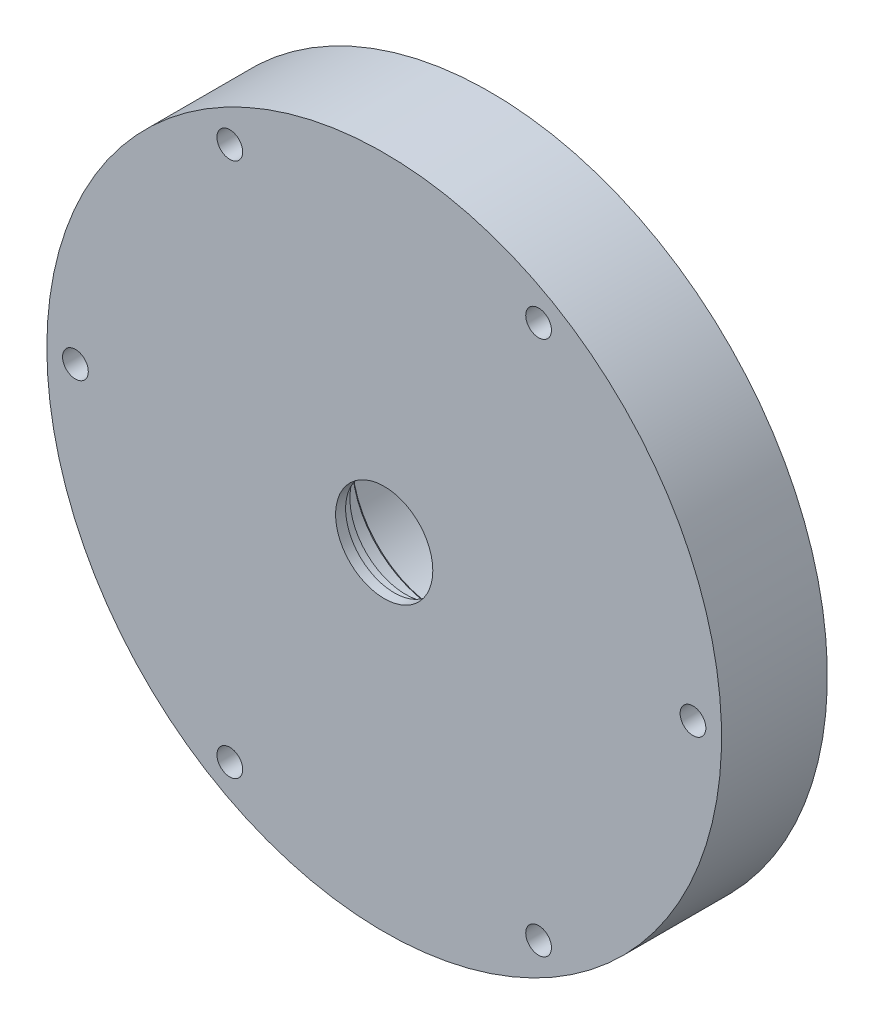
ISO-10303-21;
HEADER;
FILE_DESCRIPTION(('STEP AP214'),'2;1');
FILE_NAME('part.step','',(''),(''),'','','');
FILE_SCHEMA(('AUTOMOTIVE_DESIGN { 1 0 10303 214 1 1 1 1 }'));
ENDSEC;
DATA;
#1=APPLICATION_CONTEXT('core data for automotive mechanical design processes');
#2=APPLICATION_PROTOCOL_DEFINITION('international standard','automotive_design',2000,#1);
#3=PRODUCT_CONTEXT('',#1,'mechanical');
#4=PRODUCT('Part','Part','',(#3));
#5=PRODUCT_RELATED_PRODUCT_CATEGORY('part','',(#4));
#6=PRODUCT_DEFINITION_FORMATION('','',#4);
#7=PRODUCT_DEFINITION_CONTEXT('part definition',#1,'design');
#8=PRODUCT_DEFINITION('design','',#6,#7);
#9=PRODUCT_DEFINITION_SHAPE('','',#8);
#10=(LENGTH_UNIT() NAMED_UNIT(*) SI_UNIT(.MILLI.,.METRE.));
#11=(NAMED_UNIT(*) PLANE_ANGLE_UNIT() SI_UNIT($,.RADIAN.));
#12=(NAMED_UNIT(*) SI_UNIT($,.STERADIAN.) SOLID_ANGLE_UNIT());
#13=UNCERTAINTY_MEASURE_WITH_UNIT(LENGTH_MEASURE(1.E-05),#10,'distance_accuracy_value','');
#14=(GEOMETRIC_REPRESENTATION_CONTEXT(3) GLOBAL_UNCERTAINTY_ASSIGNED_CONTEXT((#13)) GLOBAL_UNIT_ASSIGNED_CONTEXT((#10,
#11,#12)) REPRESENTATION_CONTEXT('',''));
#15=CARTESIAN_POINT('',(0.,0.,0.));
#16=DIRECTION('',(0.,0.,1.));
#17=DIRECTION('',(1.,0.,0.));
#18=AXIS2_PLACEMENT_3D('',#15,#16,#17);
#19=CARTESIAN_POINT('',(0.,0.,0.));
#20=DIRECTION('',(0.,0.,1.));
#21=DIRECTION('',(1.,0.,0.));
#22=AXIS2_PLACEMENT_3D('',#19,#20,#21);
#23=PLANE('',#22);
#24=CARTESIAN_POINT('',(-108.,0.,0.));
#25=DIRECTION('',(0.,0.,1.));
#26=DIRECTION('',(1.,0.,0.));
#27=AXIS2_PLACEMENT_3D('',#24,#25,#26);
#28=CIRCLE('',#27,4.50000000000001);
#29=CARTESIAN_POINT('',(-103.5,0.,0.));
#30=VERTEX_POINT('',#29);
#31=EDGE_CURVE('E144',#30,#30,#28,.T.);
#32=ORIENTED_EDGE('',*,*,#31,.F.);
#33=EDGE_LOOP('',(#32));
#34=FACE_BOUND('',#33,.T.);
#35=CARTESIAN_POINT('',(-53.9999999999998,-93.5307436087195,0.));
#36=DIRECTION('',(0.,0.,1.));
#37=DIRECTION('',(1.,0.,0.));
#38=AXIS2_PLACEMENT_3D('',#35,#36,#37);
#39=CIRCLE('',#38,4.50000000000001);
#40=CARTESIAN_POINT('',(-49.4999999999998,-93.5307436087195,0.));
#41=VERTEX_POINT('',#40);
#42=EDGE_CURVE('E138',#41,#41,#39,.T.);
#43=ORIENTED_EDGE('',*,*,#42,.F.);
#44=EDGE_LOOP('',(#43));
#45=FACE_BOUND('',#44,.T.);
#46=CARTESIAN_POINT('',(54.0000000000004,-93.5307436087191,0.));
#47=DIRECTION('',(0.,0.,1.));
#48=DIRECTION('',(1.,0.,0.));
#49=AXIS2_PLACEMENT_3D('',#46,#47,#48);
#50=CIRCLE('',#49,4.50000000000001);
#51=CARTESIAN_POINT('',(58.5000000000004,-93.5307436087191,0.));
#52=VERTEX_POINT('',#51);
#53=EDGE_CURVE('E132',#52,#52,#50,.T.);
#54=ORIENTED_EDGE('',*,*,#53,.F.);
#55=EDGE_LOOP('',(#54));
#56=FACE_BOUND('',#55,.T.);
#57=CARTESIAN_POINT('',(108.,7.54159969190117E-13,0.));
#58=DIRECTION('',(0.,0.,1.));
#59=DIRECTION('',(1.,0.,0.));
#60=AXIS2_PLACEMENT_3D('',#57,#58,#59);
#61=CIRCLE('',#60,4.50000000000001);
#62=CARTESIAN_POINT('',(112.5,7.54159969190117E-13,0.));
#63=VERTEX_POINT('',#62);
#64=EDGE_CURVE('E126',#63,#63,#61,.T.);
#65=ORIENTED_EDGE('',*,*,#64,.F.);
#66=EDGE_LOOP('',(#65));
#67=FACE_BOUND('',#66,.T.);
#68=CARTESIAN_POINT('',(53.9999999999991,93.5307436087198,0.));
#69=DIRECTION('',(0.,0.,1.));
#70=DIRECTION('',(1.,0.,0.));
#71=AXIS2_PLACEMENT_3D('',#68,#69,#70);
#72=CIRCLE('',#71,4.50000000000001);
#73=CARTESIAN_POINT('',(58.4999999999991,93.5307436087198,0.));
#74=VERTEX_POINT('',#73);
#75=EDGE_CURVE('E120',#74,#74,#72,.T.);
#76=ORIENTED_EDGE('',*,*,#75,.F.);
#77=EDGE_LOOP('',(#76));
#78=FACE_BOUND('',#77,.T.);
#79=CARTESIAN_POINT('',(-54.0000000000011,93.5307436087187,0.));
#80=DIRECTION('',(0.,0.,1.));
#81=DIRECTION('',(1.,0.,0.));
#82=AXIS2_PLACEMENT_3D('',#79,#80,#81);
#83=CIRCLE('',#82,4.50000000000001);
#84=CARTESIAN_POINT('',(-49.5000000000011,93.5307436087187,0.));
#85=VERTEX_POINT('',#84);
#86=EDGE_CURVE('E114',#85,#85,#83,.T.);
#87=ORIENTED_EDGE('',*,*,#86,.F.);
#88=EDGE_LOOP('',(#87));
#89=FACE_BOUND('',#88,.T.);
#90=CARTESIAN_POINT('',(0.,0.,0.));
#91=DIRECTION('',(0.,0.,1.));
#92=DIRECTION('',(1.,0.,0.));
#93=AXIS2_PLACEMENT_3D('',#90,#91,#92);
#94=CIRCLE('',#93,17.);
#95=CARTESIAN_POINT('',(17.,0.,0.));
#96=VERTEX_POINT('',#95);
#97=EDGE_CURVE('E96',#96,#96,#94,.T.);
#98=ORIENTED_EDGE('',*,*,#97,.F.);
#99=EDGE_LOOP('',(#98));
#100=FACE_BOUND('',#99,.T.);
#101=CARTESIAN_POINT('',(0.,0.,0.));
#102=DIRECTION('',(0.,0.,-1.));
#103=DIRECTION('',(-1.,0.,0.));
#104=AXIS2_PLACEMENT_3D('',#101,#102,#103);
#105=CIRCLE('',#104,118.);
#106=CARTESIAN_POINT('',(-118.,0.,0.));
#107=VERTEX_POINT('',#106);
#108=EDGE_CURVE('E60',#107,#107,#105,.T.);
#109=ORIENTED_EDGE('',*,*,#108,.F.);
#110=EDGE_LOOP('',(#109));
#111=FACE_BOUND('',#110,.T.);
#112=ADVANCED_FACE('F39',(#34,#45,#56,#67,#78,#89,#100,#111),#23,.T.);
#113=CARTESIAN_POINT('',(0.,0.,-48.));
#114=DIRECTION('',(0.,0.,-1.));
#115=DIRECTION('',(-1.,0.,0.));
#116=AXIS2_PLACEMENT_3D('',#113,#114,#115);
#117=CYLINDRICAL_SURFACE('',#116,118.);
#118=ORIENTED_EDGE('',*,*,#108,.T.);
#119=EDGE_LOOP('',(#118));
#120=FACE_BOUND('',#119,.T.);
#121=CARTESIAN_POINT('',(0.,0.,-37.));
#122=DIRECTION('',(0.,0.,-1.));
#123=DIRECTION('',(-1.,0.,0.));
#124=AXIS2_PLACEMENT_3D('',#121,#122,#123);
#125=CIRCLE('',#124,118.);
#126=CARTESIAN_POINT('',(-118.,0.,-37.));
#127=VERTEX_POINT('',#126);
#128=EDGE_CURVE('E63',#127,#127,#125,.T.);
#129=ORIENTED_EDGE('',*,*,#128,.F.);
#130=EDGE_LOOP('',(#129));
#131=FACE_BOUND('',#130,.T.);
#132=ADVANCED_FACE('F158',(#120,#131),#117,.T.);
#133=CARTESIAN_POINT('',(0.,118.,-37.));
#134=DIRECTION('',(0.,0.,-1.));
#135=DIRECTION('',(-1.,0.,0.));
#136=AXIS2_PLACEMENT_3D('',#133,#134,#135);
#137=PLANE('',#136);
#138=CARTESIAN_POINT('',(-108.,0.,-37.));
#139=DIRECTION('',(0.,0.,-1.));
#140=DIRECTION('',(-1.,0.,0.));
#141=AXIS2_PLACEMENT_3D('',#138,#139,#140);
#142=CIRCLE('',#141,4.50000000000002);
#143=CARTESIAN_POINT('',(-112.5,0.,-37.));
#144=VERTEX_POINT('',#143);
#145=EDGE_CURVE('E147',#144,#144,#142,.T.);
#146=ORIENTED_EDGE('',*,*,#145,.F.);
#147=EDGE_LOOP('',(#146));
#148=FACE_BOUND('',#147,.T.);
#149=CARTESIAN_POINT('',(-53.9999999999998,-93.5307436087195,-37.));
#150=DIRECTION('',(0.,0.,-1.));
#151=DIRECTION('',(-1.,0.,0.));
#152=AXIS2_PLACEMENT_3D('',#149,#150,#151);
#153=CIRCLE('',#152,4.50000000000001);
#154=CARTESIAN_POINT('',(-58.4999999999998,-93.5307436087195,-37.));
#155=VERTEX_POINT('',#154);
#156=EDGE_CURVE('E141',#155,#155,#153,.T.);
#157=ORIENTED_EDGE('',*,*,#156,.F.);
#158=EDGE_LOOP('',(#157));
#159=FACE_BOUND('',#158,.T.);
#160=CARTESIAN_POINT('',(54.0000000000004,-93.5307436087191,-37.));
#161=DIRECTION('',(0.,0.,-1.));
#162=DIRECTION('',(-1.,0.,0.));
#163=AXIS2_PLACEMENT_3D('',#160,#161,#162);
#164=CIRCLE('',#163,4.50000000000001);
#165=CARTESIAN_POINT('',(49.5000000000004,-93.5307436087191,-37.));
#166=VERTEX_POINT('',#165);
#167=EDGE_CURVE('E135',#166,#166,#164,.T.);
#168=ORIENTED_EDGE('',*,*,#167,.F.);
#169=EDGE_LOOP('',(#168));
#170=FACE_BOUND('',#169,.T.);
#171=CARTESIAN_POINT('',(108.,7.54159969190117E-13,-37.));
#172=DIRECTION('',(0.,0.,-1.));
#173=DIRECTION('',(-1.,0.,0.));
#174=AXIS2_PLACEMENT_3D('',#171,#172,#173);
#175=CIRCLE('',#174,4.50000000000002);
#176=CARTESIAN_POINT('',(103.5,7.54159969190117E-13,-37.));
#177=VERTEX_POINT('',#176);
#178=EDGE_CURVE('E129',#177,#177,#175,.T.);
#179=ORIENTED_EDGE('',*,*,#178,.F.);
#180=EDGE_LOOP('',(#179));
#181=FACE_BOUND('',#180,.T.);
#182=CARTESIAN_POINT('',(53.9999999999991,93.5307436087198,-37.));
#183=DIRECTION('',(0.,0.,-1.));
#184=DIRECTION('',(-1.,0.,0.));
#185=AXIS2_PLACEMENT_3D('',#182,#183,#184);
#186=CIRCLE('',#185,4.50000000000001);
#187=CARTESIAN_POINT('',(49.4999999999991,93.5307436087198,-37.));
#188=VERTEX_POINT('',#187);
#189=EDGE_CURVE('E123',#188,#188,#186,.T.);
#190=ORIENTED_EDGE('',*,*,#189,.F.);
#191=EDGE_LOOP('',(#190));
#192=FACE_BOUND('',#191,.T.);
#193=CARTESIAN_POINT('',(-54.0000000000011,93.5307436087187,-37.));
#194=DIRECTION('',(0.,0.,-1.));
#195=DIRECTION('',(-1.,0.,0.));
#196=AXIS2_PLACEMENT_3D('',#193,#194,#195);
#197=CIRCLE('',#196,4.50000000000001);
#198=CARTESIAN_POINT('',(-58.5000000000011,93.5307436087187,-37.));
#199=VERTEX_POINT('',#198);
#200=EDGE_CURVE('E117',#199,#199,#197,.T.);
#201=ORIENTED_EDGE('',*,*,#200,.F.);
#202=EDGE_LOOP('',(#201));
#203=FACE_BOUND('',#202,.T.);
#204=ORIENTED_EDGE('',*,*,#128,.T.);
#205=EDGE_LOOP('',(#204));
#206=FACE_BOUND('',#205,.T.);
#207=CARTESIAN_POINT('',(0.,0.,-37.));
#208=DIRECTION('',(0.,0.,-1.));
#209=DIRECTION('',(-1.,0.,0.));
#210=AXIS2_PLACEMENT_3D('',#207,#208,#209);
#211=CIRCLE('',#210,95.);
#212=CARTESIAN_POINT('',(-95.,0.,-37.));
#213=VERTEX_POINT('',#212);
#214=EDGE_CURVE('E66',#213,#213,#211,.T.);
#215=ORIENTED_EDGE('',*,*,#214,.F.);
#216=EDGE_LOOP('',(#215));
#217=FACE_BOUND('',#216,.T.);
#218=ADVANCED_FACE('F154',(#148,#159,#170,#181,#192,#203,#206,#217),#137,.T.);
#219=CARTESIAN_POINT('',(0.,0.,-48.));
#220=DIRECTION('',(0.,0.,-1.));
#221=DIRECTION('',(-1.,0.,0.));
#222=AXIS2_PLACEMENT_3D('',#219,#220,#221);
#223=CYLINDRICAL_SURFACE('',#222,95.);
#224=ORIENTED_EDGE('',*,*,#214,.T.);
#225=EDGE_LOOP('',(#224));
#226=FACE_BOUND('',#225,.T.);
#227=CARTESIAN_POINT('',(0.,0.,-45.));
#228=DIRECTION('',(0.,0.,-1.));
#229=DIRECTION('',(-1.,0.,0.));
#230=AXIS2_PLACEMENT_3D('',#227,#228,#229);
#231=CIRCLE('',#230,95.);
#232=CARTESIAN_POINT('',(-95.,0.,-45.));
#233=VERTEX_POINT('',#232);
#234=EDGE_CURVE('E69',#233,#233,#231,.T.);
#235=ORIENTED_EDGE('',*,*,#234,.F.);
#236=EDGE_LOOP('',(#235));
#237=FACE_BOUND('',#236,.T.);
#238=ADVANCED_FACE('F157',(#226,#237),#223,.T.);
#239=CARTESIAN_POINT('',(0.,95.,-45.));
#240=DIRECTION('',(0.,0.,1.));
#241=DIRECTION('',(1.,0.,0.));
#242=AXIS2_PLACEMENT_3D('',#239,#240,#241);
#243=PLANE('',#242);
#244=ORIENTED_EDGE('',*,*,#234,.T.);
#245=EDGE_LOOP('',(#244));
#246=FACE_BOUND('',#245,.T.);
#247=CARTESIAN_POINT('',(0.,0.,-45.));
#248=DIRECTION('',(0.,0.,-1.));
#249=DIRECTION('',(-1.,0.,0.));
#250=AXIS2_PLACEMENT_3D('',#247,#248,#249);
#251=CIRCLE('',#250,99.);
#252=CARTESIAN_POINT('',(-99.,0.,-45.));
#253=VERTEX_POINT('',#252);
#254=EDGE_CURVE('E72',#253,#253,#251,.T.);
#255=ORIENTED_EDGE('',*,*,#254,.F.);
#256=EDGE_LOOP('',(#255));
#257=FACE_BOUND('',#256,.T.);
#258=ADVANCED_FACE('F176',(#246,#257),#243,.T.);
#259=CARTESIAN_POINT('',(0.,0.,-48.));
#260=DIRECTION('',(0.,0.,-1.));
#261=DIRECTION('',(-1.,0.,0.));
#262=AXIS2_PLACEMENT_3D('',#259,#260,#261);
#263=CYLINDRICAL_SURFACE('',#262,99.);
#264=ORIENTED_EDGE('',*,*,#254,.T.);
#265=EDGE_LOOP('',(#264));
#266=FACE_BOUND('',#265,.T.);
#267=CARTESIAN_POINT('',(0.,0.,-48.));
#268=DIRECTION('',(0.,0.,-1.));
#269=DIRECTION('',(-1.,0.,0.));
#270=AXIS2_PLACEMENT_3D('',#267,#268,#269);
#271=CIRCLE('',#270,99.);
#272=CARTESIAN_POINT('',(-99.,0.,-48.));
#273=VERTEX_POINT('',#272);
#274=EDGE_CURVE('E75',#273,#273,#271,.T.);
#275=ORIENTED_EDGE('',*,*,#274,.F.);
#276=EDGE_LOOP('',(#275));
#277=FACE_BOUND('',#276,.T.);
#278=ADVANCED_FACE('F182',(#266,#277),#263,.T.);
#279=CARTESIAN_POINT('',(0.,99.,-48.));
#280=DIRECTION('',(0.,0.,-1.));
#281=DIRECTION('',(-1.,0.,0.));
#282=AXIS2_PLACEMENT_3D('',#279,#280,#281);
#283=PLANE('',#282);
#284=CARTESIAN_POINT('',(0.,0.,-48.));
#285=DIRECTION('',(0.,0.,1.));
#286=DIRECTION('',(1.,0.,0.));
#287=AXIS2_PLACEMENT_3D('',#284,#285,#286);
#288=CIRCLE('',#287,91.);
#289=CARTESIAN_POINT('',(91.,0.,-48.));
#290=VERTEX_POINT('',#289);
#291=EDGE_CURVE('E78',#290,#290,#288,.T.);
#292=ORIENTED_EDGE('',*,*,#291,.T.);
#293=EDGE_LOOP('',(#292));
#294=FACE_BOUND('',#293,.T.);
#295=ORIENTED_EDGE('',*,*,#274,.T.);
#296=EDGE_LOOP('',(#295));
#297=FACE_BOUND('',#296,.T.);
#298=ADVANCED_FACE('F188',(#294,#297),#283,.T.);
#299=CARTESIAN_POINT('',(0.,0.,0.));
#300=DIRECTION('',(0.,0.,1.));
#301=DIRECTION('',(1.,0.,0.));
#302=AXIS2_PLACEMENT_3D('',#299,#300,#301);
#303=CYLINDRICAL_SURFACE('',#302,91.);
#304=CARTESIAN_POINT('',(0.,0.,-11.));
#305=DIRECTION('',(0.,0.,1.));
#306=DIRECTION('',(1.,0.,0.));
#307=AXIS2_PLACEMENT_3D('',#304,#305,#306);
#308=CIRCLE('',#307,91.);
#309=CARTESIAN_POINT('',(91.,0.,-11.));
#310=VERTEX_POINT('',#309);
#311=EDGE_CURVE('E81',#310,#310,#308,.T.);
#312=ORIENTED_EDGE('',*,*,#311,.T.);
#313=EDGE_LOOP('',(#312));
#314=FACE_BOUND('',#313,.T.);
#315=ORIENTED_EDGE('',*,*,#291,.F.);
#316=EDGE_LOOP('',(#315));
#317=FACE_BOUND('',#316,.T.);
#318=ADVANCED_FACE('F193',(#314,#317),#303,.F.);
#319=CARTESIAN_POINT('',(0.,91.,-11.));
#320=DIRECTION('',(0.,0.,-1.));
#321=DIRECTION('',(-1.,0.,0.));
#322=AXIS2_PLACEMENT_3D('',#319,#320,#321);
#323=PLANE('',#322);
#324=CARTESIAN_POINT('',(0.,0.,-11.));
#325=DIRECTION('',(0.,0.,1.));
#326=DIRECTION('',(1.,0.,0.));
#327=AXIS2_PLACEMENT_3D('',#324,#325,#326);
#328=CIRCLE('',#327,56.);
#329=CARTESIAN_POINT('',(56.,0.,-11.));
#330=VERTEX_POINT('',#329);
#331=EDGE_CURVE('E84',#330,#330,#328,.T.);
#332=ORIENTED_EDGE('',*,*,#331,.T.);
#333=EDGE_LOOP('',(#332));
#334=FACE_BOUND('',#333,.T.);
#335=ORIENTED_EDGE('',*,*,#311,.F.);
#336=EDGE_LOOP('',(#335));
#337=FACE_BOUND('',#336,.T.);
#338=ADVANCED_FACE('F199',(#334,#337),#323,.T.);
#339=CARTESIAN_POINT('',(0.,0.,0.));
#340=DIRECTION('',(0.,0.,1.));
#341=DIRECTION('',(1.,0.,0.));
#342=AXIS2_PLACEMENT_3D('',#339,#340,#341);
#343=CYLINDRICAL_SURFACE('',#342,56.);
#344=CARTESIAN_POINT('',(0.,0.,-12.5));
#345=DIRECTION('',(0.,0.,1.));
#346=DIRECTION('',(1.,0.,0.));
#347=AXIS2_PLACEMENT_3D('',#344,#345,#346);
#348=CIRCLE('',#347,56.);
#349=CARTESIAN_POINT('',(56.,0.,-12.5));
#350=VERTEX_POINT('',#349);
#351=EDGE_CURVE('E87',#350,#350,#348,.T.);
#352=ORIENTED_EDGE('',*,*,#351,.T.);
#353=EDGE_LOOP('',(#352));
#354=FACE_BOUND('',#353,.T.);
#355=ORIENTED_EDGE('',*,*,#331,.F.);
#356=EDGE_LOOP('',(#355));
#357=FACE_BOUND('',#356,.T.);
#358=ADVANCED_FACE('F277',(#354,#357),#343,.T.);
#359=CARTESIAN_POINT('',(0.,56.,-12.5));
#360=DIRECTION('',(0.,0.,-1.));
#361=DIRECTION('',(-1.,0.,0.));
#362=AXIS2_PLACEMENT_3D('',#359,#360,#361);
#363=PLANE('',#362);
#364=CARTESIAN_POINT('',(0.,0.,-12.5));
#365=DIRECTION('',(0.,0.,1.));
#366=DIRECTION('',(1.,0.,0.));
#367=AXIS2_PLACEMENT_3D('',#364,#365,#366);
#368=CIRCLE('',#367,45.);
#369=CARTESIAN_POINT('',(45.,0.,-12.5));
#370=VERTEX_POINT('',#369);
#371=EDGE_CURVE('E90',#370,#370,#368,.T.);
#372=ORIENTED_EDGE('',*,*,#371,.T.);
#373=EDGE_LOOP('',(#372));
#374=FACE_BOUND('',#373,.T.);
#375=ORIENTED_EDGE('',*,*,#351,.F.);
#376=EDGE_LOOP('',(#375));
#377=FACE_BOUND('',#376,.T.);
#378=ADVANCED_FACE('F273',(#374,#377),#363,.T.);
#379=CARTESIAN_POINT('',(0.,0.,0.));
#380=DIRECTION('',(0.,0.,1.));
#381=DIRECTION('',(1.,0.,0.));
#382=AXIS2_PLACEMENT_3D('',#379,#380,#381);
#383=CYLINDRICAL_SURFACE('',#382,45.);
#384=CARTESIAN_POINT('',(0.,0.,-38.75));
#385=DIRECTION('',(0.,0.,1.));
#386=DIRECTION('',(1.,0.,0.));
#387=AXIS2_PLACEMENT_3D('',#384,#385,#386);
#388=CIRCLE('',#387,45.);
#389=CARTESIAN_POINT('',(45.,0.,-38.75));
#390=VERTEX_POINT('',#389);
#391=EDGE_CURVE('E93',#390,#390,#388,.T.);
#392=ORIENTED_EDGE('',*,*,#391,.T.);
#393=EDGE_LOOP('',(#392));
#394=FACE_BOUND('',#393,.T.);
#395=ORIENTED_EDGE('',*,*,#371,.F.);
#396=EDGE_LOOP('',(#395));
#397=FACE_BOUND('',#396,.T.);
#398=ADVANCED_FACE('F270',(#394,#397),#383,.T.);
#399=CARTESIAN_POINT('',(0.,45.,-38.75));
#400=DIRECTION('',(0.,0.,-1.));
#401=DIRECTION('',(-1.,0.,0.));
#402=AXIS2_PLACEMENT_3D('',#399,#400,#401);
#403=PLANE('',#402);
#404=CARTESIAN_POINT('',(0.,0.,-38.75));
#405=DIRECTION('',(0.,0.,-1.));
#406=DIRECTION('',(-1.,0.,0.));
#407=AXIS2_PLACEMENT_3D('',#404,#405,#406);
#408=CIRCLE('',#407,37.);
#409=CARTESIAN_POINT('',(-37.,0.,-38.75));
#410=VERTEX_POINT('',#409);
#411=EDGE_CURVE('E47',#410,#410,#408,.F.);
#412=ORIENTED_EDGE('',*,*,#411,.T.);
#413=EDGE_LOOP('',(#412));
#414=FACE_BOUND('',#413,.T.);
#415=ORIENTED_EDGE('',*,*,#391,.F.);
#416=EDGE_LOOP('',(#415));
#417=FACE_BOUND('',#416,.T.);
#418=ADVANCED_FACE('F266',(#414,#417),#403,.T.);
#419=CARTESIAN_POINT('',(0.,0.,0.));
#420=DIRECTION('',(0.,0.,1.));
#421=DIRECTION('',(1.,0.,0.));
#422=AXIS2_PLACEMENT_3D('',#419,#420,#421);
#423=CYLINDRICAL_SURFACE('',#422,17.);
#424=ORIENTED_EDGE('',*,*,#97,.T.);
#425=EDGE_LOOP('',(#424));
#426=FACE_BOUND('',#425,.T.);
#427=CARTESIAN_POINT('',(0.,0.,-3.5));
#428=DIRECTION('',(0.,0.,1.));
#429=DIRECTION('',(1.,0.,0.));
#430=AXIS2_PLACEMENT_3D('',#427,#428,#429);
#431=CIRCLE('',#430,17.);
#432=CARTESIAN_POINT('',(17.,0.,-3.5));
#433=VERTEX_POINT('',#432);
#434=EDGE_CURVE('E99',#433,#433,#431,.T.);
#435=ORIENTED_EDGE('',*,*,#434,.F.);
#436=EDGE_LOOP('',(#435));
#437=FACE_BOUND('',#436,.T.);
#438=ADVANCED_FACE('F262',(#426,#437),#423,.F.);
#439=CARTESIAN_POINT('',(0.,17.,-3.5));
#440=DIRECTION('',(0.,0.,-1.));
#441=DIRECTION('',(-1.,0.,0.));
#442=AXIS2_PLACEMENT_3D('',#439,#440,#441);
#443=PLANE('',#442);
#444=ORIENTED_EDGE('',*,*,#434,.T.);
#445=EDGE_LOOP('',(#444));
#446=FACE_BOUND('',#445,.T.);
#447=CARTESIAN_POINT('',(0.,0.,-3.5));
#448=DIRECTION('',(0.,0.,1.));
#449=DIRECTION('',(1.,0.,0.));
#450=AXIS2_PLACEMENT_3D('',#447,#448,#449);
#451=CIRCLE('',#450,19.5);
#452=CARTESIAN_POINT('',(19.5,0.,-3.5));
#453=VERTEX_POINT('',#452);
#454=EDGE_CURVE('E102',#453,#453,#451,.T.);
#455=ORIENTED_EDGE('',*,*,#454,.F.);
#456=EDGE_LOOP('',(#455));
#457=FACE_BOUND('',#456,.T.);
#458=ADVANCED_FACE('F258',(#446,#457),#443,.T.);
#459=CARTESIAN_POINT('',(0.,0.,0.));
#460=DIRECTION('',(0.,0.,1.));
#461=DIRECTION('',(1.,0.,0.));
#462=AXIS2_PLACEMENT_3D('',#459,#460,#461);
#463=CYLINDRICAL_SURFACE('',#462,19.5);
#464=ORIENTED_EDGE('',*,*,#454,.T.);
#465=EDGE_LOOP('',(#464));
#466=FACE_BOUND('',#465,.T.);
#467=CARTESIAN_POINT('',(0.,0.,-7.5));
#468=DIRECTION('',(0.,0.,1.));
#469=DIRECTION('',(1.,0.,0.));
#470=AXIS2_PLACEMENT_3D('',#467,#468,#469);
#471=CIRCLE('',#470,19.5);
#472=CARTESIAN_POINT('',(19.5,0.,-7.5));
#473=VERTEX_POINT('',#472);
#474=EDGE_CURVE('E105',#473,#473,#471,.T.);
#475=ORIENTED_EDGE('',*,*,#474,.F.);
#476=EDGE_LOOP('',(#475));
#477=FACE_BOUND('',#476,.T.);
#478=ADVANCED_FACE('F254',(#466,#477),#463,.F.);
#479=CARTESIAN_POINT('',(0.,19.5,-7.5));
#480=DIRECTION('',(0.,0.,-1.));
#481=DIRECTION('',(-1.,0.,0.));
#482=AXIS2_PLACEMENT_3D('',#479,#480,#481);
#483=PLANE('',#482);
#484=ORIENTED_EDGE('',*,*,#474,.T.);
#485=EDGE_LOOP('',(#484));
#486=FACE_BOUND('',#485,.T.);
#487=CARTESIAN_POINT('',(0.,0.,-7.5));
#488=DIRECTION('',(0.,0.,1.));
#489=DIRECTION('',(1.,0.,0.));
#490=AXIS2_PLACEMENT_3D('',#487,#488,#489);
#491=CIRCLE('',#490,30.);
#492=CARTESIAN_POINT('',(30.,0.,-7.5));
#493=VERTEX_POINT('',#492);
#494=EDGE_CURVE('E108',#493,#493,#491,.T.);
#495=ORIENTED_EDGE('',*,*,#494,.F.);
#496=EDGE_LOOP('',(#495));
#497=FACE_BOUND('',#496,.T.);
#498=ADVANCED_FACE('F251',(#486,#497),#483,.T.);
#499=CARTESIAN_POINT('',(0.,0.,0.));
#500=DIRECTION('',(0.,0.,1.));
#501=DIRECTION('',(1.,0.,0.));
#502=AXIS2_PLACEMENT_3D('',#499,#500,#501);
#503=CYLINDRICAL_SURFACE('',#502,30.);
#504=CARTESIAN_POINT('',(0.,0.,-18.75));
#505=DIRECTION('',(0.,0.,-1.));
#506=DIRECTION('',(-1.,0.,0.));
#507=AXIS2_PLACEMENT_3D('',#504,#505,#506);
#508=CIRCLE('',#507,30.);
#509=CARTESIAN_POINT('',(-30.,0.,-18.75));
#510=VERTEX_POINT('',#509);
#511=EDGE_CURVE('E51',#510,#510,#508,.T.);
#512=ORIENTED_EDGE('',*,*,#511,.T.);
#513=EDGE_LOOP('',(#512));
#514=FACE_BOUND('',#513,.T.);
#515=ORIENTED_EDGE('',*,*,#494,.T.);
#516=EDGE_LOOP('',(#515));
#517=FACE_BOUND('',#516,.T.);
#518=ADVANCED_FACE('F235',(#514,#517),#503,.F.);
#519=CARTESIAN_POINT('',(0.,30.,-19.75));
#520=DIRECTION('',(0.,0.,-1.));
#521=DIRECTION('',(-1.,0.,0.));
#522=AXIS2_PLACEMENT_3D('',#519,#520,#521);
#523=PLANE('',#522);
#524=CARTESIAN_POINT('',(0.,0.,-19.75));
#525=DIRECTION('',(0.,0.,-1.));
#526=DIRECTION('',(-1.,0.,0.));
#527=AXIS2_PLACEMENT_3D('',#524,#525,#526);
#528=CIRCLE('',#527,31.);
#529=CARTESIAN_POINT('',(-31.,0.,-19.75));
#530=VERTEX_POINT('',#529);
#531=EDGE_CURVE('E55',#530,#530,#528,.F.);
#532=ORIENTED_EDGE('',*,*,#531,.T.);
#533=EDGE_LOOP('',(#532));
#534=FACE_BOUND('',#533,.T.);
#535=CARTESIAN_POINT('',(0.,0.,-19.75));
#536=DIRECTION('',(0.,0.,1.));
#537=DIRECTION('',(1.,0.,0.));
#538=AXIS2_PLACEMENT_3D('',#535,#536,#537);
#539=CIRCLE('',#538,36.);
#540=CARTESIAN_POINT('',(36.,0.,-19.75));
#541=VERTEX_POINT('',#540);
#542=EDGE_CURVE('E111',#541,#541,#539,.T.);
#543=ORIENTED_EDGE('',*,*,#542,.F.);
#544=EDGE_LOOP('',(#543));
#545=FACE_BOUND('',#544,.T.);
#546=ADVANCED_FACE('F231',(#534,#545),#523,.T.);
#547=CARTESIAN_POINT('',(0.,0.,0.));
#548=DIRECTION('',(0.,0.,1.));
#549=DIRECTION('',(1.,0.,0.));
#550=AXIS2_PLACEMENT_3D('',#547,#548,#549);
#551=CYLINDRICAL_SURFACE('',#550,36.);
#552=CARTESIAN_POINT('',(0.,0.,-37.75));
#553=DIRECTION('',(0.,0.,-1.));
#554=DIRECTION('',(-1.,0.,0.));
#555=AXIS2_PLACEMENT_3D('',#552,#553,#554);
#556=CIRCLE('',#555,36.);
#557=CARTESIAN_POINT('',(-36.,0.,-37.75));
#558=VERTEX_POINT('',#557);
#559=EDGE_CURVE('E10',#558,#558,#556,.T.);
#560=ORIENTED_EDGE('',*,*,#559,.T.);
#561=EDGE_LOOP('',(#560));
#562=FACE_BOUND('',#561,.T.);
#563=ORIENTED_EDGE('',*,*,#542,.T.);
#564=EDGE_LOOP('',(#563));
#565=FACE_BOUND('',#564,.T.);
#566=ADVANCED_FACE('F234',(#562,#565),#551,.F.);
#567=CARTESIAN_POINT('',(-54.0000000000011,93.5307436087187,-37.));
#568=DIRECTION('',(0.,0.,-1.));
#569=DIRECTION('',(-1.,0.,0.));
#570=AXIS2_PLACEMENT_3D('',#567,#568,#569);
#571=CYLINDRICAL_SURFACE('',#570,4.50000000000001);
#572=ORIENTED_EDGE('',*,*,#200,.T.);
#573=EDGE_LOOP('',(#572));
#574=FACE_BOUND('',#573,.T.);
#575=ORIENTED_EDGE('',*,*,#86,.T.);
#576=EDGE_LOOP('',(#575));
#577=FACE_BOUND('',#576,.T.);
#578=ADVANCED_FACE('F239',(#574,#577),#571,.F.);
#579=CARTESIAN_POINT('',(53.9999999999991,93.5307436087198,-37.));
#580=DIRECTION('',(0.,0.,-1.));
#581=DIRECTION('',(-1.,0.,0.));
#582=AXIS2_PLACEMENT_3D('',#579,#580,#581);
#583=CYLINDRICAL_SURFACE('',#582,4.50000000000001);
#584=ORIENTED_EDGE('',*,*,#189,.T.);
#585=EDGE_LOOP('',(#584));
#586=FACE_BOUND('',#585,.T.);
#587=ORIENTED_EDGE('',*,*,#75,.T.);
#588=EDGE_LOOP('',(#587));
#589=FACE_BOUND('',#588,.T.);
#590=ADVANCED_FACE('F244',(#586,#589),#583,.F.);
#591=CARTESIAN_POINT('',(108.,7.54159969190117E-13,-37.));
#592=DIRECTION('',(0.,0.,-1.));
#593=DIRECTION('',(-1.,0.,0.));
#594=AXIS2_PLACEMENT_3D('',#591,#592,#593);
#595=CYLINDRICAL_SURFACE('',#594,4.50000000000001);
#596=ORIENTED_EDGE('',*,*,#178,.T.);
#597=EDGE_LOOP('',(#596));
#598=FACE_BOUND('',#597,.T.);
#599=ORIENTED_EDGE('',*,*,#64,.T.);
#600=EDGE_LOOP('',(#599));
#601=FACE_BOUND('',#600,.T.);
#602=ADVANCED_FACE('F362',(#598,#601),#595,.F.);
#603=CARTESIAN_POINT('',(54.0000000000004,-93.5307436087191,-37.));
#604=DIRECTION('',(0.,0.,-1.));
#605=DIRECTION('',(-1.,0.,0.));
#606=AXIS2_PLACEMENT_3D('',#603,#604,#605);
#607=CYLINDRICAL_SURFACE('',#606,4.50000000000001);
#608=ORIENTED_EDGE('',*,*,#167,.T.);
#609=EDGE_LOOP('',(#608));
#610=FACE_BOUND('',#609,.T.);
#611=ORIENTED_EDGE('',*,*,#53,.T.);
#612=EDGE_LOOP('',(#611));
#613=FACE_BOUND('',#612,.T.);
#614=ADVANCED_FACE('F371',(#610,#613),#607,.F.);
#615=CARTESIAN_POINT('',(-53.9999999999998,-93.5307436087195,-37.));
#616=DIRECTION('',(0.,0.,-1.));
#617=DIRECTION('',(-1.,0.,0.));
#618=AXIS2_PLACEMENT_3D('',#615,#616,#617);
#619=CYLINDRICAL_SURFACE('',#618,4.50000000000001);
#620=ORIENTED_EDGE('',*,*,#156,.T.);
#621=EDGE_LOOP('',(#620));
#622=FACE_BOUND('',#621,.T.);
#623=ORIENTED_EDGE('',*,*,#42,.T.);
#624=EDGE_LOOP('',(#623));
#625=FACE_BOUND('',#624,.T.);
#626=ADVANCED_FACE('F225',(#622,#625),#619,.F.);
#627=CARTESIAN_POINT('',(-108.,0.,-37.));
#628=DIRECTION('',(0.,0.,-1.));
#629=DIRECTION('',(-1.,0.,0.));
#630=AXIS2_PLACEMENT_3D('',#627,#628,#629);
#631=CYLINDRICAL_SURFACE('',#630,4.50000000000001);
#632=ORIENTED_EDGE('',*,*,#145,.T.);
#633=EDGE_LOOP('',(#632));
#634=FACE_BOUND('',#633,.T.);
#635=ORIENTED_EDGE('',*,*,#31,.T.);
#636=EDGE_LOOP('',(#635));
#637=FACE_BOUND('',#636,.T.);
#638=ADVANCED_FACE('F151',(#634,#637),#631,.F.);
#639=CARTESIAN_POINT('',(0.,0.,-19.75));
#640=DIRECTION('',(0.,0.,-1.));
#641=DIRECTION('',(-1.,0.,0.));
#642=AXIS2_PLACEMENT_3D('',#639,#640,#641);
#643=CONICAL_SURFACE('',#642,31.,0.785398163397443);
#644=ORIENTED_EDGE('',*,*,#511,.F.);
#645=EDGE_LOOP('',(#644));
#646=FACE_BOUND('',#645,.T.);
#647=ORIENTED_EDGE('',*,*,#531,.F.);
#648=EDGE_LOOP('',(#647));
#649=FACE_BOUND('',#648,.T.);
#650=ADVANCED_FACE('F214',(#646,#649),#643,.F.);
#651=CARTESIAN_POINT('',(0.,0.,-38.75));
#652=DIRECTION('',(0.,0.,-1.));
#653=DIRECTION('',(-1.,0.,0.));
#654=AXIS2_PLACEMENT_3D('',#651,#652,#653);
#655=CONICAL_SURFACE('',#654,37.,0.785398163397428);
#656=ORIENTED_EDGE('',*,*,#559,.F.);
#657=EDGE_LOOP('',(#656));
#658=FACE_BOUND('',#657,.T.);
#659=ORIENTED_EDGE('',*,*,#411,.F.);
#660=EDGE_LOOP('',(#659));
#661=FACE_BOUND('',#660,.T.);
#662=ADVANCED_FACE('F42',(#658,#661),#655,.F.);
#663=CLOSED_SHELL('',(#112,#132,#218,#238,#258,#278,#298,#318,#338,#358,#378,#398,#418,#438,
#458,#478,#498,#518,#546,#566,#578,#590,#602,#614,#626,#638,#650,#662));
#664=MANIFOLD_SOLID_BREP('B2',#663);
#665=ADVANCED_BREP_SHAPE_REPRESENTATION('',(#18,#664),#14);
#666=SHAPE_DEFINITION_REPRESENTATION(#9,#665);
ENDSEC;
END-ISO-10303-21;
